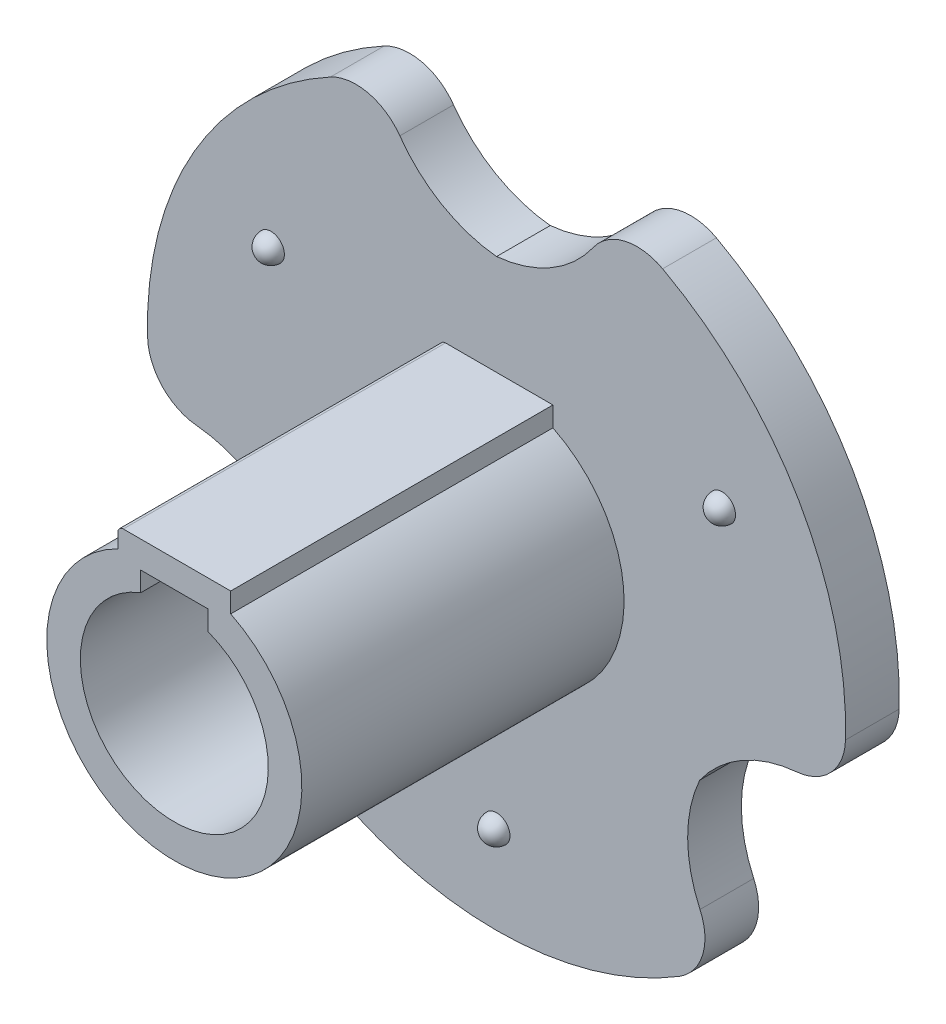
ISO-10303-21;
HEADER;
FILE_DESCRIPTION(('STEP AP214'),'2;1');
FILE_NAME('part.step','',(''),(''),'','','');
FILE_SCHEMA(('AUTOMOTIVE_DESIGN { 1 0 10303 214 1 1 1 1 }'));
ENDSEC;
DATA;
#1=APPLICATION_CONTEXT('core data for automotive mechanical design processes');
#2=APPLICATION_PROTOCOL_DEFINITION('international standard','automotive_design',2000,#1);
#3=PRODUCT_CONTEXT('',#1,'mechanical');
#4=PRODUCT('Part','Part','',(#3));
#5=PRODUCT_RELATED_PRODUCT_CATEGORY('part','',(#4));
#6=PRODUCT_DEFINITION_FORMATION('','',#4);
#7=PRODUCT_DEFINITION_CONTEXT('part definition',#1,'design');
#8=PRODUCT_DEFINITION('design','',#6,#7);
#9=PRODUCT_DEFINITION_SHAPE('','',#8);
#10=(LENGTH_UNIT() NAMED_UNIT(*) SI_UNIT(.MILLI.,.METRE.));
#11=(NAMED_UNIT(*) PLANE_ANGLE_UNIT() SI_UNIT($,.RADIAN.));
#12=(NAMED_UNIT(*) SI_UNIT($,.STERADIAN.) SOLID_ANGLE_UNIT());
#13=UNCERTAINTY_MEASURE_WITH_UNIT(LENGTH_MEASURE(1.E-05),#10,'distance_accuracy_value','');
#14=(GEOMETRIC_REPRESENTATION_CONTEXT(3) GLOBAL_UNCERTAINTY_ASSIGNED_CONTEXT((#13)) GLOBAL_UNIT_ASSIGNED_CONTEXT((#10,
#11,#12)) REPRESENTATION_CONTEXT('',''));
#15=CARTESIAN_POINT('',(0.,0.,0.));
#16=DIRECTION('',(0.,0.,1.));
#17=DIRECTION('',(1.,0.,0.));
#18=AXIS2_PLACEMENT_3D('',#15,#16,#17);
#19=CARTESIAN_POINT('',(0.,0.,-2.));
#20=DIRECTION('',(0.,0.,-1.));
#21=DIRECTION('',(-1.,0.,0.));
#22=AXIS2_PLACEMENT_3D('',#19,#20,#21);
#23=PLANE('',#22);
#24=CARTESIAN_POINT('',(0.,0.,-2.));
#25=DIRECTION('',(0.,0.,-1.));
#26=DIRECTION('',(-1.,0.,0.));
#27=AXIS2_PLACEMENT_3D('',#24,#25,#26);
#28=CIRCLE('',#27,6.);
#29=CARTESIAN_POINT('',(-6.,0.,-2.));
#30=VERTEX_POINT('',#29);
#31=EDGE_CURVE('E228',#30,#30,#28,.T.);
#32=ORIENTED_EDGE('',*,*,#31,.F.);
#33=EDGE_LOOP('',(#32));
#34=FACE_BOUND('',#33,.T.);
#35=CARTESIAN_POINT('',(10.995799380185,-0.303967088222063,-2.));
#36=DIRECTION('',(0.,0.,1.));
#37=DIRECTION('',(0.500000000000004,0.866025403784436,0.));
#38=AXIS2_PLACEMENT_3D('',#35,#36,#37);
#39=CIRCLE('',#38,2.);
#40=CARTESIAN_POINT('',(11.1783144305914,-2.29562174111125,-2.));
#41=VERTEX_POINT('',#40);
#42=CARTESIAN_POINT('',(12.9950356311278,-0.359233831535164,-2.));
#43=VERTEX_POINT('',#42);
#44=EDGE_CURVE('E204',#41,#43,#39,.T.);
#45=ORIENTED_EDGE('',*,*,#44,.F.);
#46=CARTESIAN_POINT('',(11.6346020566073,-7.27475837333423,-2.));
#47=DIRECTION('',(0.,0.,-1.));
#48=DIRECTION('',(-0.500000000000004,-0.866025403784436,0.));
#49=AXIS2_PLACEMENT_3D('',#46,#47,#48);
#50=CIRCLE('',#49,5.);
#51=CARTESIAN_POINT('',(7.5661233301834,-4.36830334140334,-2.));
#52=VERTEX_POINT('',#51);
#53=EDGE_CURVE('E478',#52,#41,#50,.T.);
#54=ORIENTED_EDGE('',*,*,#53,.F.);
#55=CARTESIAN_POINT('',(12.1174265860046,-6.43848175727757,-2.));
#56=DIRECTION('',(0.,0.,-1.));
#57=DIRECTION('',(0.500000000000004,0.866025403784436,0.));
#58=AXIS2_PLACEMENT_3D('',#55,#56,#57);
#59=CIRCLE('',#58,5.);
#60=CARTESIAN_POINT('',(7.57722396057783,-8.53289339782678,-2.));
#61=VERTEX_POINT('',#60);
#62=EDGE_CURVE('E213',#61,#52,#59,.T.);
#63=ORIENTED_EDGE('',*,*,#62,.F.);
#64=CARTESIAN_POINT('',(5.76114291040713,-9.37065805404646,-2.));
#65=DIRECTION('',(0.,0.,1.));
#66=DIRECTION('',(-0.500000000000004,-0.866025403784436,0.));
#67=AXIS2_PLACEMENT_3D('',#64,#65,#66);
#68=CIRCLE('',#67,2.);
#69=CARTESIAN_POINT('',(6.80862343957206,-11.0744140638731,-2.));
#70=VERTEX_POINT('',#69);
#71=EDGE_CURVE('E198',#70,#61,#68,.T.);
#72=ORIENTED_EDGE('',*,*,#71,.F.);
#73=CARTESIAN_POINT('',(0.,0.,-2.));
#74=DIRECTION('',(0.,0.,-1.));
#75=DIRECTION('',(-1.,0.,0.));
#76=AXIS2_PLACEMENT_3D('',#73,#74,#75);
#77=CIRCLE('',#76,13.);
#78=CARTESIAN_POINT('',(-6.80862343957222,-11.074414063873,-2.));
#79=VERTEX_POINT('',#78);
#80=EDGE_CURVE('E209',#70,#79,#77,.T.);
#81=ORIENTED_EDGE('',*,*,#80,.T.);
#82=CARTESIAN_POINT('',(-5.76114291040727,-9.37065805404637,-2.));
#83=DIRECTION('',(0.,0.,1.));
#84=DIRECTION('',(0.499999999999991,-0.866025403784444,0.));
#85=AXIS2_PLACEMENT_3D('',#82,#83,#84);
#86=CIRCLE('',#85,2.);
#87=CARTESIAN_POINT('',(-7.57722396057795,-8.53289339782666,-2.));
#88=VERTEX_POINT('',#87);
#89=EDGE_CURVE('E396',#88,#79,#86,.T.);
#90=ORIENTED_EDGE('',*,*,#89,.F.);
#91=CARTESIAN_POINT('',(-12.1174265860047,-6.43848175727739,-2.));
#92=DIRECTION('',(0.,0.,-1.));
#93=DIRECTION('',(-0.499999999999991,0.866025403784444,0.));
#94=AXIS2_PLACEMENT_3D('',#91,#92,#93);
#95=CIRCLE('',#94,5.);
#96=CARTESIAN_POINT('',(-7.56612333018347,-4.36830334140323,-2.));
#97=VERTEX_POINT('',#96);
#98=EDGE_CURVE('E414',#97,#88,#95,.T.);
#99=ORIENTED_EDGE('',*,*,#98,.F.);
#100=CARTESIAN_POINT('',(-11.6346020566074,-7.27475837333406,-2.));
#101=DIRECTION('',(0.,0.,-1.));
#102=DIRECTION('',(0.499999999999991,-0.866025403784444,0.));
#103=AXIS2_PLACEMENT_3D('',#100,#101,#102);
#104=CIRCLE('',#103,5.);
#105=CARTESIAN_POINT('',(-11.1783144305914,-2.29562174111109,-2.));
#106=VERTEX_POINT('',#105);
#107=EDGE_CURVE('E406',#106,#97,#104,.T.);
#108=ORIENTED_EDGE('',*,*,#107,.F.);
#109=CARTESIAN_POINT('',(-10.995799380185,-0.303967088221901,-2.));
#110=DIRECTION('',(0.,0.,1.));
#111=DIRECTION('',(-0.499999999999991,0.866025403784444,0.));
#112=AXIS2_PLACEMENT_3D('',#109,#110,#111);
#113=CIRCLE('',#112,2.);
#114=CARTESIAN_POINT('',(-12.9950356311278,-0.359233831534972,-2.));
#115=VERTEX_POINT('',#114);
#116=EDGE_CURVE('E403',#115,#106,#113,.T.);
#117=ORIENTED_EDGE('',*,*,#116,.F.);
#118=CARTESIAN_POINT('',(-6.18641219155567,11.4336478954082,-2.));
#119=VERTEX_POINT('',#118);
#120=EDGE_CURVE('E221',#115,#119,#77,.T.);
#121=ORIENTED_EDGE('',*,*,#120,.T.);
#122=CARTESIAN_POINT('',(-5.23465646977788,9.67462514226844,-2.));
#123=DIRECTION('',(0.,0.,1.));
#124=DIRECTION('',(-1.,0.,0.));
#125=AXIS2_PLACEMENT_3D('',#122,#123,#124);
#126=CIRCLE('',#125,2.);
#127=CARTESIAN_POINT('',(-3.60109047001354,10.8285151389379,-2.));
#128=VERTEX_POINT('',#127);
#129=EDGE_CURVE('E443',#128,#119,#126,.T.);
#130=ORIENTED_EDGE('',*,*,#129,.F.);
#131=CARTESIAN_POINT('',(0.482824529397304,13.7132401306117,-2.));
#132=DIRECTION('',(0.,0.,-1.));
#133=DIRECTION('',(1.,0.,0.));
#134=AXIS2_PLACEMENT_3D('',#131,#132,#133);
#135=CIRCLE('',#134,5.);
#136=CARTESIAN_POINT('',(0.,8.73660668280661,-2.));
#137=VERTEX_POINT('',#136);
#138=EDGE_CURVE('E440',#137,#128,#135,.T.);
#139=ORIENTED_EDGE('',*,*,#138,.F.);
#140=CARTESIAN_POINT('',(-0.482824529397304,13.7132401306117,-2.));
#141=DIRECTION('',(0.,0.,-1.));
#142=DIRECTION('',(-1.,0.,0.));
#143=AXIS2_PLACEMENT_3D('',#140,#141,#142);
#144=CIRCLE('',#143,5.);
#145=CARTESIAN_POINT('',(3.60109047001354,10.8285151389379,-2.));
#146=VERTEX_POINT('',#145);
#147=EDGE_CURVE('E437',#146,#137,#144,.T.);
#148=ORIENTED_EDGE('',*,*,#147,.F.);
#149=CARTESIAN_POINT('',(5.23465646977788,9.67462514226844,-2.));
#150=DIRECTION('',(0.,0.,1.));
#151=DIRECTION('',(1.,0.,0.));
#152=AXIS2_PLACEMENT_3D('',#149,#150,#151);
#153=CIRCLE('',#152,2.);
#154=CARTESIAN_POINT('',(6.18641219155567,11.4336478954082,-2.));
#155=VERTEX_POINT('',#154);
#156=EDGE_CURVE('E434',#155,#146,#153,.T.);
#157=ORIENTED_EDGE('',*,*,#156,.F.);
#158=EDGE_CURVE('E220',#155,#43,#77,.T.);
#159=ORIENTED_EDGE('',*,*,#158,.T.);
#160=EDGE_LOOP('',(#45,#54,#63,#72,#81,#90,#99,#108,#117,#121,#130,#139,#148,#157,#159));
#161=FACE_BOUND('',#160,.T.);
#162=ADVANCED_FACE('F37',(#34,#161),#23,.T.);
#163=CARTESIAN_POINT('',(0.,0.,0.));
#164=DIRECTION('',(0.,0.,-1.));
#165=DIRECTION('',(-1.,0.,0.));
#166=AXIS2_PLACEMENT_3D('',#163,#164,#165);
#167=PLANE('',#166);
#168=CARTESIAN_POINT('',(8.4004464167091,4.84999999999992,0.));
#169=DIRECTION('',(0.,0.,-1.));
#170=DIRECTION('',(-1.,0.,0.));
#171=AXIS2_PLACEMENT_3D('',#168,#169,#170);
#172=CIRCLE('',#171,0.5);
#173=CARTESIAN_POINT('',(7.9004464167091,4.84999999999992,0.));
#174=VERTEX_POINT('',#173);
#175=EDGE_CURVE('E300',#174,#174,#172,.F.);
#176=ORIENTED_EDGE('',*,*,#175,.F.);
#177=EDGE_LOOP('',(#176));
#178=FACE_BOUND('',#177,.T.);
#179=CARTESIAN_POINT('',(-8.40044641670903,4.85000000000004,0.));
#180=DIRECTION('',(0.,0.,-1.));
#181=DIRECTION('',(-1.,0.,0.));
#182=AXIS2_PLACEMENT_3D('',#179,#180,#181);
#183=CIRCLE('',#182,0.5);
#184=CARTESIAN_POINT('',(-8.90044641670903,4.85000000000004,0.));
#185=VERTEX_POINT('',#184);
#186=EDGE_CURVE('E297',#185,#185,#183,.F.);
#187=ORIENTED_EDGE('',*,*,#186,.F.);
#188=EDGE_LOOP('',(#187));
#189=FACE_BOUND('',#188,.T.);
#190=CARTESIAN_POINT('',(0.,-9.7,0.));
#191=DIRECTION('',(0.,0.,-1.));
#192=DIRECTION('',(-1.,0.,0.));
#193=AXIS2_PLACEMENT_3D('',#190,#191,#192);
#194=CIRCLE('',#193,0.5);
#195=CARTESIAN_POINT('',(-0.499999999999999,-9.7,0.));
#196=VERTEX_POINT('',#195);
#197=EDGE_CURVE('E294',#196,#196,#194,.F.);
#198=ORIENTED_EDGE('',*,*,#197,.F.);
#199=EDGE_LOOP('',(#198));
#200=FACE_BOUND('',#199,.T.);
#201=DIRECTION('',(0.,-1.,0.));
#202=VECTOR('',#201,1.);
#203=CARTESIAN_POINT('',(-2.1,5.,0.));
#204=LINE('',#203,#202);
#205=CARTESIAN_POINT('',(-2.1,4.8,0.));
#206=VERTEX_POINT('',#205);
#207=CARTESIAN_POINT('',(-2.1,4.26057507855454,0.));
#208=VERTEX_POINT('',#207);
#209=EDGE_CURVE('E250',#206,#208,#204,.T.);
#210=ORIENTED_EDGE('',*,*,#209,.F.);
#211=CARTESIAN_POINT('',(-1.9,4.8,0.));
#212=DIRECTION('',(0.,0.,-1.));
#213=DIRECTION('',(-1.,0.,0.));
#214=AXIS2_PLACEMENT_3D('',#211,#212,#213);
#215=CIRCLE('',#214,0.2);
#216=CARTESIAN_POINT('',(-1.9,5.,0.));
#217=VERTEX_POINT('',#216);
#218=EDGE_CURVE('E11',#206,#217,#215,.T.);
#219=ORIENTED_EDGE('',*,*,#218,.T.);
#220=DIRECTION('',(-1.,0.,0.));
#221=VECTOR('',#220,1.);
#222=CARTESIAN_POINT('',(-2.1,5.,0.));
#223=LINE('',#222,#221);
#224=CARTESIAN_POINT('',(2.1,5.,0.));
#225=VERTEX_POINT('',#224);
#226=EDGE_CURVE('E254',#225,#217,#223,.T.);
#227=ORIENTED_EDGE('',*,*,#226,.F.);
#228=DIRECTION('',(0.,1.,0.));
#229=VECTOR('',#228,1.);
#230=CARTESIAN_POINT('',(2.1,5.,0.));
#231=LINE('',#230,#229);
#232=CARTESIAN_POINT('',(2.1,4.26057507855454,0.));
#233=VERTEX_POINT('',#232);
#234=EDGE_CURVE('E266',#233,#225,#231,.T.);
#235=ORIENTED_EDGE('',*,*,#234,.F.);
#236=CARTESIAN_POINT('',(0.,0.,0.));
#237=DIRECTION('',(0.,0.,1.));
#238=DIRECTION('',(1.,0.,0.));
#239=AXIS2_PLACEMENT_3D('',#236,#237,#238);
#240=CIRCLE('',#239,4.75);
#241=EDGE_CURVE('E263',#208,#233,#240,.T.);
#242=ORIENTED_EDGE('',*,*,#241,.F.);
#243=EDGE_LOOP('',(#210,#219,#227,#235,#242));
#244=FACE_BOUND('',#243,.T.);
#245=CARTESIAN_POINT('',(11.6346020566073,-7.27475837333423,0.));
#246=DIRECTION('',(0.,0.,-1.));
#247=DIRECTION('',(-1.,0.,0.));
#248=AXIS2_PLACEMENT_3D('',#245,#246,#247);
#249=CIRCLE('',#248,5.);
#250=CARTESIAN_POINT('',(11.1783144305914,-2.29562174111125,0.));
#251=VERTEX_POINT('',#250);
#252=CARTESIAN_POINT('',(7.5661233301834,-4.36830334140334,0.));
#253=VERTEX_POINT('',#252);
#254=EDGE_CURVE('E470',#251,#253,#249,.F.);
#255=ORIENTED_EDGE('',*,*,#254,.F.);
#256=CARTESIAN_POINT('',(10.995799380185,-0.303967088222063,0.));
#257=DIRECTION('',(0.,0.,-1.));
#258=DIRECTION('',(-1.,0.,0.));
#259=AXIS2_PLACEMENT_3D('',#256,#257,#258);
#260=CIRCLE('',#259,2.);
#261=CARTESIAN_POINT('',(12.9950356311278,-0.359233831535164,0.));
#262=VERTEX_POINT('',#261);
#263=EDGE_CURVE('E214',#262,#251,#260,.T.);
#264=ORIENTED_EDGE('',*,*,#263,.F.);
#265=CARTESIAN_POINT('',(0.,0.,0.));
#266=DIRECTION('',(0.,0.,-1.));
#267=DIRECTION('',(-1.,0.,0.));
#268=AXIS2_PLACEMENT_3D('',#265,#266,#267);
#269=CIRCLE('',#268,13.);
#270=CARTESIAN_POINT('',(6.18641219155567,11.4336478954082,0.));
#271=VERTEX_POINT('',#270);
#272=EDGE_CURVE('E225',#271,#262,#269,.T.);
#273=ORIENTED_EDGE('',*,*,#272,.F.);
#274=CARTESIAN_POINT('',(5.23465646977788,9.67462514226844,0.));
#275=DIRECTION('',(0.,0.,-1.));
#276=DIRECTION('',(-1.,0.,0.));
#277=AXIS2_PLACEMENT_3D('',#274,#275,#276);
#278=CIRCLE('',#277,2.);
#279=CARTESIAN_POINT('',(3.60109047001354,10.8285151389379,0.));
#280=VERTEX_POINT('',#279);
#281=EDGE_CURVE('E381',#280,#271,#278,.T.);
#282=ORIENTED_EDGE('',*,*,#281,.F.);
#283=CARTESIAN_POINT('',(-0.482824529397304,13.7132401306117,0.));
#284=DIRECTION('',(0.,0.,-1.));
#285=DIRECTION('',(-1.,0.,0.));
#286=AXIS2_PLACEMENT_3D('',#283,#284,#285);
#287=CIRCLE('',#286,5.);
#288=CARTESIAN_POINT('',(0.,8.73660668280661,0.));
#289=VERTEX_POINT('',#288);
#290=EDGE_CURVE('E426',#289,#280,#287,.F.);
#291=ORIENTED_EDGE('',*,*,#290,.F.);
#292=CARTESIAN_POINT('',(0.482824529397304,13.7132401306117,0.));
#293=DIRECTION('',(0.,0.,-1.));
#294=DIRECTION('',(-1.,0.,0.));
#295=AXIS2_PLACEMENT_3D('',#292,#293,#294);
#296=CIRCLE('',#295,5.);
#297=CARTESIAN_POINT('',(-3.60109047001354,10.8285151389379,0.));
#298=VERTEX_POINT('',#297);
#299=EDGE_CURVE('E428',#298,#289,#296,.F.);
#300=ORIENTED_EDGE('',*,*,#299,.F.);
#301=CARTESIAN_POINT('',(-5.23465646977788,9.67462514226844,0.));
#302=DIRECTION('',(0.,0.,-1.));
#303=DIRECTION('',(-1.,0.,0.));
#304=AXIS2_PLACEMENT_3D('',#301,#302,#303);
#305=CIRCLE('',#304,2.);
#306=CARTESIAN_POINT('',(-6.18641219155567,11.4336478954082,0.));
#307=VERTEX_POINT('',#306);
#308=EDGE_CURVE('E431',#307,#298,#305,.T.);
#309=ORIENTED_EDGE('',*,*,#308,.F.);
#310=CARTESIAN_POINT('',(-12.9950356311278,-0.359233831534973,0.));
#311=VERTEX_POINT('',#310);
#312=EDGE_CURVE('E233',#311,#307,#269,.T.);
#313=ORIENTED_EDGE('',*,*,#312,.F.);
#314=CARTESIAN_POINT('',(-10.995799380185,-0.303967088221901,0.));
#315=DIRECTION('',(0.,0.,-1.));
#316=DIRECTION('',(-1.,0.,0.));
#317=AXIS2_PLACEMENT_3D('',#314,#315,#316);
#318=CIRCLE('',#317,2.);
#319=CARTESIAN_POINT('',(-11.1783144305914,-2.29562174111109,0.));
#320=VERTEX_POINT('',#319);
#321=EDGE_CURVE('E60',#320,#311,#318,.T.);
#322=ORIENTED_EDGE('',*,*,#321,.F.);
#323=CARTESIAN_POINT('',(-11.6346020566074,-7.27475837333406,0.));
#324=DIRECTION('',(0.,0.,-1.));
#325=DIRECTION('',(-1.,0.,0.));
#326=AXIS2_PLACEMENT_3D('',#323,#324,#325);
#327=CIRCLE('',#326,5.);
#328=CARTESIAN_POINT('',(-7.56612333018347,-4.36830334140323,0.));
#329=VERTEX_POINT('',#328);
#330=EDGE_CURVE('E408',#329,#320,#327,.F.);
#331=ORIENTED_EDGE('',*,*,#330,.F.);
#332=CARTESIAN_POINT('',(-12.1174265860047,-6.43848175727739,0.));
#333=DIRECTION('',(0.,0.,-1.));
#334=DIRECTION('',(-1.,0.,0.));
#335=AXIS2_PLACEMENT_3D('',#332,#333,#334);
#336=CIRCLE('',#335,5.);
#337=CARTESIAN_POINT('',(-7.57722396057795,-8.53289339782666,0.));
#338=VERTEX_POINT('',#337);
#339=EDGE_CURVE('E402',#338,#329,#336,.F.);
#340=ORIENTED_EDGE('',*,*,#339,.F.);
#341=CARTESIAN_POINT('',(-5.76114291040727,-9.37065805404637,0.));
#342=DIRECTION('',(0.,0.,-1.));
#343=DIRECTION('',(-1.,0.,0.));
#344=AXIS2_PLACEMENT_3D('',#341,#342,#343);
#345=CIRCLE('',#344,2.);
#346=CARTESIAN_POINT('',(-6.80862343957222,-11.074414063873,0.));
#347=VERTEX_POINT('',#346);
#348=EDGE_CURVE('E394',#347,#338,#345,.T.);
#349=ORIENTED_EDGE('',*,*,#348,.F.);
#350=CARTESIAN_POINT('',(6.80862343957206,-11.0744140638731,0.));
#351=VERTEX_POINT('',#350);
#352=EDGE_CURVE('E232',#351,#347,#269,.T.);
#353=ORIENTED_EDGE('',*,*,#352,.F.);
#354=CARTESIAN_POINT('',(5.76114291040713,-9.37065805404646,0.));
#355=DIRECTION('',(0.,0.,-1.));
#356=DIRECTION('',(-1.,0.,0.));
#357=AXIS2_PLACEMENT_3D('',#354,#355,#356);
#358=CIRCLE('',#357,2.);
#359=CARTESIAN_POINT('',(7.57722396057783,-8.53289339782678,0.));
#360=VERTEX_POINT('',#359);
#361=EDGE_CURVE('E52',#360,#351,#358,.T.);
#362=ORIENTED_EDGE('',*,*,#361,.F.);
#363=CARTESIAN_POINT('',(12.1174265860046,-6.43848175727757,0.));
#364=DIRECTION('',(0.,0.,-1.));
#365=DIRECTION('',(-1.,0.,0.));
#366=AXIS2_PLACEMENT_3D('',#363,#364,#365);
#367=CIRCLE('',#366,5.);
#368=EDGE_CURVE('E473',#253,#360,#367,.F.);
#369=ORIENTED_EDGE('',*,*,#368,.F.);
#370=EDGE_LOOP('',(#255,#264,#273,#282,#291,#300,#309,#313,#322,#331,#340,#349,#353,#362,#369));
#371=FACE_BOUND('',#370,.T.);
#372=ADVANCED_FACE('F322',(#178,#189,#200,#244,#371),#167,.F.);
#373=CARTESIAN_POINT('',(0.,0.,-2.));
#374=DIRECTION('',(0.,0.,1.));
#375=DIRECTION('',(1.,0.,0.));
#376=AXIS2_PLACEMENT_3D('',#373,#374,#375);
#377=CYLINDRICAL_SURFACE('',#376,13.);
#378=DIRECTION('',(0.,0.,-1.));
#379=VECTOR('',#378,1.);
#380=CARTESIAN_POINT('',(6.80862343957206,-11.0744140638731,12.001));
#381=LINE('',#380,#379);
#382=EDGE_CURVE('E195',#351,#70,#381,.T.);
#383=ORIENTED_EDGE('',*,*,#382,.F.);
#384=ORIENTED_EDGE('',*,*,#352,.T.);
#385=DIRECTION('',(0.,0.,-1.));
#386=VECTOR('',#385,1.);
#387=CARTESIAN_POINT('',(-6.80862343957222,-11.074414063873,12.001));
#388=LINE('',#387,#386);
#389=EDGE_CURVE('E219',#347,#79,#388,.T.);
#390=ORIENTED_EDGE('',*,*,#389,.T.);
#391=ORIENTED_EDGE('',*,*,#80,.F.);
#392=EDGE_LOOP('',(#383,#384,#390,#391));
#393=FACE_BOUND('',#392,.T.);
#394=ADVANCED_FACE('F217',(#393),#377,.T.);
#395=DIRECTION('',(0.,0.,-1.));
#396=VECTOR('',#395,1.);
#397=CARTESIAN_POINT('',(-12.9950356311278,-0.359233831534972,12.001));
#398=LINE('',#397,#396);
#399=EDGE_CURVE('E417',#311,#115,#398,.T.);
#400=ORIENTED_EDGE('',*,*,#399,.F.);
#401=ORIENTED_EDGE('',*,*,#312,.T.);
#402=DIRECTION('',(0.,0.,-1.));
#403=VECTOR('',#402,1.);
#404=CARTESIAN_POINT('',(-6.18641219155567,11.4336478954082,12.001));
#405=LINE('',#404,#403);
#406=EDGE_CURVE('E447',#307,#119,#405,.T.);
#407=ORIENTED_EDGE('',*,*,#406,.T.);
#408=ORIENTED_EDGE('',*,*,#120,.F.);
#409=EDGE_LOOP('',(#400,#401,#407,#408));
#410=FACE_BOUND('',#409,.T.);
#411=ADVANCED_FACE('F354',(#410),#377,.T.);
#412=CARTESIAN_POINT('',(0.,0.,-2.));
#413=DIRECTION('',(0.,0.,-1.));
#414=DIRECTION('',(-1.,0.,0.));
#415=AXIS2_PLACEMENT_3D('',#412,#413,#414);
#416=CIRCLE('',#415,4.75);
#417=CARTESIAN_POINT('',(-4.75,0.,-2.));
#418=VERTEX_POINT('',#417);
#419=EDGE_CURVE('E279',#418,#418,#416,.F.);
#420=ORIENTED_EDGE('',*,*,#419,.F.);
#421=EDGE_LOOP('',(#420));
#422=FACE_BOUND('',#421,.T.);
#423=DIRECTION('',(0.,-1.,0.));
#424=VECTOR('',#423,1.);
#425=CARTESIAN_POINT('',(-1.25,4.,-2.));
#426=LINE('',#425,#424);
#427=CARTESIAN_POINT('',(-1.25,4.,-2.));
#428=VERTEX_POINT('',#427);
#429=CARTESIAN_POINT('',(-1.25,3.2691742076555,-2.));
#430=VERTEX_POINT('',#429);
#431=EDGE_CURVE('E370',#428,#430,#426,.T.);
#432=ORIENTED_EDGE('',*,*,#431,.T.);
#433=CARTESIAN_POINT('',(0.,0.,-2.));
#434=DIRECTION('',(0.,0.,-1.));
#435=DIRECTION('',(-1.,0.,0.));
#436=AXIS2_PLACEMENT_3D('',#433,#434,#435);
#437=CIRCLE('',#436,3.5);
#438=CARTESIAN_POINT('',(1.25,3.2691742076555,-2.));
#439=VERTEX_POINT('',#438);
#440=EDGE_CURVE('E373',#430,#439,#437,.F.);
#441=ORIENTED_EDGE('',*,*,#440,.T.);
#442=DIRECTION('',(0.,1.,0.));
#443=VECTOR('',#442,1.);
#444=CARTESIAN_POINT('',(1.25,3.2691742076555,-2.));
#445=LINE('',#444,#443);
#446=CARTESIAN_POINT('',(1.25,4.,-2.));
#447=VERTEX_POINT('',#446);
#448=EDGE_CURVE('E379',#439,#447,#445,.T.);
#449=ORIENTED_EDGE('',*,*,#448,.T.);
#450=DIRECTION('',(-1.,0.,0.));
#451=VECTOR('',#450,1.);
#452=CARTESIAN_POINT('',(1.25,4.,-2.));
#453=LINE('',#452,#451);
#454=EDGE_CURVE('E375',#447,#428,#453,.T.);
#455=ORIENTED_EDGE('',*,*,#454,.T.);
#456=EDGE_LOOP('',(#432,#441,#449,#455));
#457=FACE_BOUND('',#456,.T.);
#458=ADVANCED_FACE('F345',(#422,#457),#23,.T.);
#459=CARTESIAN_POINT('',(0.,0.,12.));
#460=DIRECTION('',(0.,0.,1.));
#461=DIRECTION('',(1.,0.,0.));
#462=AXIS2_PLACEMENT_3D('',#459,#460,#461);
#463=PLANE('',#462);
#464=DIRECTION('',(-1.,0.,0.));
#465=VECTOR('',#464,1.);
#466=CARTESIAN_POINT('',(-2.1,5.,12.));
#467=LINE('',#466,#465);
#468=CARTESIAN_POINT('',(2.1,5.,12.));
#469=VERTEX_POINT('',#468);
#470=CARTESIAN_POINT('',(-1.9,5.,12.));
#471=VERTEX_POINT('',#470);
#472=EDGE_CURVE('E258',#469,#471,#467,.T.);
#473=ORIENTED_EDGE('',*,*,#472,.T.);
#474=CARTESIAN_POINT('',(-1.9,4.8,12.));
#475=DIRECTION('',(0.,0.,1.));
#476=DIRECTION('',(1.,0.,0.));
#477=AXIS2_PLACEMENT_3D('',#474,#475,#476);
#478=CIRCLE('',#477,0.2);
#479=CARTESIAN_POINT('',(-2.1,4.8,12.));
#480=VERTEX_POINT('',#479);
#481=EDGE_CURVE('E45',#471,#480,#478,.T.);
#482=ORIENTED_EDGE('',*,*,#481,.T.);
#483=DIRECTION('',(0.,-1.,0.));
#484=VECTOR('',#483,1.);
#485=CARTESIAN_POINT('',(-2.1,5.,12.));
#486=LINE('',#485,#484);
#487=CARTESIAN_POINT('',(-2.1,4.26057507855454,12.));
#488=VERTEX_POINT('',#487);
#489=EDGE_CURVE('E251',#480,#488,#486,.T.);
#490=ORIENTED_EDGE('',*,*,#489,.T.);
#491=CARTESIAN_POINT('',(0.,0.,12.));
#492=DIRECTION('',(0.,0.,1.));
#493=DIRECTION('',(1.,0.,0.));
#494=AXIS2_PLACEMENT_3D('',#491,#492,#493);
#495=CIRCLE('',#494,4.75);
#496=CARTESIAN_POINT('',(2.1,4.26057507855454,12.));
#497=VERTEX_POINT('',#496);
#498=EDGE_CURVE('E253',#488,#497,#495,.T.);
#499=ORIENTED_EDGE('',*,*,#498,.T.);
#500=DIRECTION('',(0.,1.,0.));
#501=VECTOR('',#500,1.);
#502=CARTESIAN_POINT('',(2.1,5.,12.));
#503=LINE('',#502,#501);
#504=EDGE_CURVE('E256',#497,#469,#503,.T.);
#505=ORIENTED_EDGE('',*,*,#504,.T.);
#506=EDGE_LOOP('',(#473,#482,#490,#499,#505));
#507=FACE_BOUND('',#506,.T.);
#508=CARTESIAN_POINT('',(0.,0.,12.));
#509=DIRECTION('',(0.,0.,1.));
#510=DIRECTION('',(1.,0.,0.));
#511=AXIS2_PLACEMENT_3D('',#508,#509,#510);
#512=CIRCLE('',#511,3.5);
#513=CARTESIAN_POINT('',(-1.25,3.2691742076555,12.));
#514=VERTEX_POINT('',#513);
#515=CARTESIAN_POINT('',(1.25,3.2691742076555,12.));
#516=VERTEX_POINT('',#515);
#517=EDGE_CURVE('E235',#514,#516,#512,.T.);
#518=ORIENTED_EDGE('',*,*,#517,.F.);
#519=DIRECTION('',(0.,-1.,0.));
#520=VECTOR('',#519,1.);
#521=CARTESIAN_POINT('',(-1.25,4.,12.));
#522=LINE('',#521,#520);
#523=CARTESIAN_POINT('',(-1.25,4.,12.));
#524=VERTEX_POINT('',#523);
#525=EDGE_CURVE('E224',#524,#514,#522,.T.);
#526=ORIENTED_EDGE('',*,*,#525,.F.);
#527=DIRECTION('',(-1.,0.,0.));
#528=VECTOR('',#527,1.);
#529=CARTESIAN_POINT('',(-1.25,4.,12.));
#530=LINE('',#529,#528);
#531=CARTESIAN_POINT('',(1.25,4.,12.));
#532=VERTEX_POINT('',#531);
#533=EDGE_CURVE('E240',#532,#524,#530,.T.);
#534=ORIENTED_EDGE('',*,*,#533,.F.);
#535=DIRECTION('',(0.,1.,0.));
#536=VECTOR('',#535,1.);
#537=CARTESIAN_POINT('',(1.25,4.,12.));
#538=LINE('',#537,#536);
#539=EDGE_CURVE('E237',#516,#532,#538,.T.);
#540=ORIENTED_EDGE('',*,*,#539,.F.);
#541=EDGE_LOOP('',(#518,#526,#534,#540));
#542=FACE_BOUND('',#541,.T.);
#543=ADVANCED_FACE('F310',(#507,#542),#463,.T.);
#544=CARTESIAN_POINT('',(-2.1,5.,12.));
#545=DIRECTION('',(1.,0.,0.));
#546=DIRECTION('',(0.,0.,-1.));
#547=AXIS2_PLACEMENT_3D('',#544,#545,#546);
#548=PLANE('',#547);
#549=ORIENTED_EDGE('',*,*,#489,.F.);
#550=DIRECTION('',(0.,0.,-1.));
#551=VECTOR('',#550,1.);
#552=CARTESIAN_POINT('',(-2.1,4.8,12.));
#553=LINE('',#552,#551);
#554=EDGE_CURVE('E303',#480,#206,#553,.T.);
#555=ORIENTED_EDGE('',*,*,#554,.T.);
#556=ORIENTED_EDGE('',*,*,#209,.T.);
#557=DIRECTION('',(0.,0.,-1.));
#558=VECTOR('',#557,1.);
#559=CARTESIAN_POINT('',(-2.1,4.26057507855454,12.));
#560=LINE('',#559,#558);
#561=EDGE_CURVE('E276',#488,#208,#560,.T.);
#562=ORIENTED_EDGE('',*,*,#561,.F.);
#563=EDGE_LOOP('',(#549,#555,#556,#562));
#564=FACE_BOUND('',#563,.T.);
#565=ADVANCED_FACE('F319',(#564),#548,.F.);
#566=CARTESIAN_POINT('',(0.,0.,12.));
#567=DIRECTION('',(0.,0.,-1.));
#568=DIRECTION('',(-1.,0.,0.));
#569=AXIS2_PLACEMENT_3D('',#566,#567,#568);
#570=CYLINDRICAL_SURFACE('',#569,4.75);
#571=ORIENTED_EDGE('',*,*,#241,.T.);
#572=DIRECTION('',(0.,0.,-1.));
#573=VECTOR('',#572,1.);
#574=CARTESIAN_POINT('',(2.1,4.26057507855454,12.));
#575=LINE('',#574,#573);
#576=EDGE_CURVE('E273',#497,#233,#575,.T.);
#577=ORIENTED_EDGE('',*,*,#576,.F.);
#578=ORIENTED_EDGE('',*,*,#498,.F.);
#579=ORIENTED_EDGE('',*,*,#561,.T.);
#580=EDGE_LOOP('',(#571,#577,#578,#579));
#581=FACE_BOUND('',#580,.T.);
#582=ADVANCED_FACE('F333',(#581),#570,.T.);
#583=CARTESIAN_POINT('',(2.1,5.,12.));
#584=DIRECTION('',(-1.,0.,0.));
#585=DIRECTION('',(0.,-1.,0.));
#586=AXIS2_PLACEMENT_3D('',#583,#584,#585);
#587=PLANE('',#586);
#588=ORIENTED_EDGE('',*,*,#234,.T.);
#589=DIRECTION('',(0.,0.,-1.));
#590=VECTOR('',#589,1.);
#591=CARTESIAN_POINT('',(2.1,5.,12.));
#592=LINE('',#591,#590);
#593=EDGE_CURVE('E261',#469,#225,#592,.T.);
#594=ORIENTED_EDGE('',*,*,#593,.F.);
#595=ORIENTED_EDGE('',*,*,#504,.F.);
#596=ORIENTED_EDGE('',*,*,#576,.T.);
#597=EDGE_LOOP('',(#588,#594,#595,#596));
#598=FACE_BOUND('',#597,.T.);
#599=ADVANCED_FACE('F330',(#598),#587,.F.);
#600=CARTESIAN_POINT('',(-2.1,5.,12.));
#601=DIRECTION('',(0.,-1.,0.));
#602=DIRECTION('',(1.,0.,0.));
#603=AXIS2_PLACEMENT_3D('',#600,#601,#602);
#604=PLANE('',#603);
#605=ORIENTED_EDGE('',*,*,#226,.T.);
#606=DIRECTION('',(0.,0.,-1.));
#607=VECTOR('',#606,1.);
#608=CARTESIAN_POINT('',(-1.9,5.,12.));
#609=LINE('',#608,#607);
#610=EDGE_CURVE('E306',#217,#471,#609,.F.);
#611=ORIENTED_EDGE('',*,*,#610,.T.);
#612=ORIENTED_EDGE('',*,*,#472,.F.);
#613=ORIENTED_EDGE('',*,*,#593,.T.);
#614=EDGE_LOOP('',(#605,#611,#612,#613));
#615=FACE_BOUND('',#614,.T.);
#616=ADVANCED_FACE('F326',(#615),#604,.F.);
#617=CARTESIAN_POINT('',(-1.25,4.,12.));
#618=DIRECTION('',(1.,0.,0.));
#619=DIRECTION('',(0.,1.,0.));
#620=AXIS2_PLACEMENT_3D('',#617,#618,#619);
#621=PLANE('',#620);
#622=DIRECTION('',(0.,0.,-1.));
#623=VECTOR('',#622,1.);
#624=CARTESIAN_POINT('',(-1.25,3.2691742076555,12.));
#625=LINE('',#624,#623);
#626=EDGE_CURVE('E248',#514,#430,#625,.T.);
#627=ORIENTED_EDGE('',*,*,#626,.T.);
#628=ORIENTED_EDGE('',*,*,#431,.F.);
#629=DIRECTION('',(0.,0.,-1.));
#630=VECTOR('',#629,1.);
#631=CARTESIAN_POINT('',(-1.25,4.,12.));
#632=LINE('',#631,#630);
#633=EDGE_CURVE('E242',#524,#428,#632,.T.);
#634=ORIENTED_EDGE('',*,*,#633,.F.);
#635=ORIENTED_EDGE('',*,*,#525,.T.);
#636=EDGE_LOOP('',(#627,#628,#634,#635));
#637=FACE_BOUND('',#636,.T.);
#638=ADVANCED_FACE('F744',(#637),#621,.T.);
#639=CARTESIAN_POINT('',(0.,0.,12.));
#640=DIRECTION('',(0.,0.,-1.));
#641=DIRECTION('',(-1.,0.,0.));
#642=AXIS2_PLACEMENT_3D('',#639,#640,#641);
#643=CYLINDRICAL_SURFACE('',#642,3.5);
#644=DIRECTION('',(0.,0.,-1.));
#645=VECTOR('',#644,1.);
#646=CARTESIAN_POINT('',(1.25,3.2691742076555,12.));
#647=LINE('',#646,#645);
#648=EDGE_CURVE('E246',#516,#439,#647,.T.);
#649=ORIENTED_EDGE('',*,*,#648,.T.);
#650=ORIENTED_EDGE('',*,*,#440,.F.);
#651=ORIENTED_EDGE('',*,*,#626,.F.);
#652=ORIENTED_EDGE('',*,*,#517,.T.);
#653=EDGE_LOOP('',(#649,#650,#651,#652));
#654=FACE_BOUND('',#653,.T.);
#655=ADVANCED_FACE('F750',(#654),#643,.F.);
#656=CARTESIAN_POINT('',(1.25,4.,12.));
#657=DIRECTION('',(-1.,0.,0.));
#658=DIRECTION('',(0.,-1.,0.));
#659=AXIS2_PLACEMENT_3D('',#656,#657,#658);
#660=PLANE('',#659);
#661=DIRECTION('',(0.,0.,-1.));
#662=VECTOR('',#661,1.);
#663=CARTESIAN_POINT('',(1.25,4.,12.));
#664=LINE('',#663,#662);
#665=EDGE_CURVE('E244',#532,#447,#664,.T.);
#666=ORIENTED_EDGE('',*,*,#665,.T.);
#667=ORIENTED_EDGE('',*,*,#448,.F.);
#668=ORIENTED_EDGE('',*,*,#648,.F.);
#669=ORIENTED_EDGE('',*,*,#539,.T.);
#670=EDGE_LOOP('',(#666,#667,#668,#669));
#671=FACE_BOUND('',#670,.T.);
#672=ADVANCED_FACE('F763',(#671),#660,.T.);
#673=CARTESIAN_POINT('',(-1.25,4.,12.));
#674=DIRECTION('',(0.,-1.,0.));
#675=DIRECTION('',(1.,0.,0.));
#676=AXIS2_PLACEMENT_3D('',#673,#674,#675);
#677=PLANE('',#676);
#678=ORIENTED_EDGE('',*,*,#633,.T.);
#679=ORIENTED_EDGE('',*,*,#454,.F.);
#680=ORIENTED_EDGE('',*,*,#665,.F.);
#681=ORIENTED_EDGE('',*,*,#533,.T.);
#682=EDGE_LOOP('',(#678,#679,#680,#681));
#683=FACE_BOUND('',#682,.T.);
#684=ADVANCED_FACE('F657',(#683),#677,.T.);
#685=ORIENTED_EDGE('',*,*,#272,.T.);
#686=DIRECTION('',(0.,0.,-1.));
#687=VECTOR('',#686,1.);
#688=CARTESIAN_POINT('',(12.9950356311278,-0.359233831535164,12.001));
#689=LINE('',#688,#687);
#690=EDGE_CURVE('E482',#262,#43,#689,.T.);
#691=ORIENTED_EDGE('',*,*,#690,.T.);
#692=ORIENTED_EDGE('',*,*,#158,.F.);
#693=DIRECTION('',(0.,0.,-1.));
#694=VECTOR('',#693,1.);
#695=CARTESIAN_POINT('',(6.18641219155567,11.4336478954082,12.001));
#696=LINE('',#695,#694);
#697=EDGE_CURVE('E446',#271,#155,#696,.T.);
#698=ORIENTED_EDGE('',*,*,#697,.F.);
#699=EDGE_LOOP('',(#685,#691,#692,#698));
#700=FACE_BOUND('',#699,.T.);
#701=ADVANCED_FACE('F363',(#700),#377,.T.);
#702=CARTESIAN_POINT('',(0.,0.,-3.1));
#703=DIRECTION('',(0.,0.,-1.));
#704=DIRECTION('',(-1.,0.,0.));
#705=AXIS2_PLACEMENT_3D('',#702,#703,#704);
#706=PLANE('',#705);
#707=CARTESIAN_POINT('',(0.,0.,-3.1));
#708=DIRECTION('',(0.,0.,-1.));
#709=DIRECTION('',(-1.,0.,0.));
#710=AXIS2_PLACEMENT_3D('',#707,#708,#709);
#711=CIRCLE('',#710,5.25);
#712=CARTESIAN_POINT('',(-5.25,0.,-3.1));
#713=VERTEX_POINT('',#712);
#714=EDGE_CURVE('E291',#713,#713,#711,.F.);
#715=ORIENTED_EDGE('',*,*,#714,.T.);
#716=EDGE_LOOP('',(#715));
#717=FACE_BOUND('',#716,.T.);
#718=CARTESIAN_POINT('',(0.,0.,-3.1));
#719=DIRECTION('',(0.,0.,-1.));
#720=DIRECTION('',(-1.,0.,0.));
#721=AXIS2_PLACEMENT_3D('',#718,#719,#720);
#722=CIRCLE('',#721,5.5);
#723=CARTESIAN_POINT('',(-5.5,0.,-3.1));
#724=VERTEX_POINT('',#723);
#725=EDGE_CURVE('E282',#724,#724,#722,.T.);
#726=ORIENTED_EDGE('',*,*,#725,.T.);
#727=EDGE_LOOP('',(#726));
#728=FACE_BOUND('',#727,.T.);
#729=ADVANCED_FACE('F547',(#717,#728),#706,.T.);
#730=CARTESIAN_POINT('',(0.,0.,-3.1));
#731=DIRECTION('',(0.,0.,1.));
#732=DIRECTION('',(1.,0.,0.));
#733=AXIS2_PLACEMENT_3D('',#730,#731,#732);
#734=CYLINDRICAL_SURFACE('',#733,6.);
#735=CARTESIAN_POINT('',(0.,0.,-2.6));
#736=DIRECTION('',(0.,0.,-1.));
#737=DIRECTION('',(-1.,0.,0.));
#738=AXIS2_PLACEMENT_3D('',#735,#736,#737);
#739=CIRCLE('',#738,6.);
#740=CARTESIAN_POINT('',(-6.,0.,-2.6));
#741=VERTEX_POINT('',#740);
#742=EDGE_CURVE('E285',#741,#741,#739,.F.);
#743=ORIENTED_EDGE('',*,*,#742,.T.);
#744=EDGE_LOOP('',(#743));
#745=FACE_BOUND('',#744,.T.);
#746=ORIENTED_EDGE('',*,*,#31,.T.);
#747=EDGE_LOOP('',(#746));
#748=FACE_BOUND('',#747,.T.);
#749=ADVANCED_FACE('F545',(#745,#748),#734,.T.);
#750=CARTESIAN_POINT('',(0.,0.,-3.1));
#751=DIRECTION('',(0.,0.,1.));
#752=DIRECTION('',(1.,0.,0.));
#753=AXIS2_PLACEMENT_3D('',#750,#751,#752);
#754=CYLINDRICAL_SURFACE('',#753,4.75);
#755=CARTESIAN_POINT('',(0.,0.,-2.6));
#756=DIRECTION('',(0.,0.,-1.));
#757=DIRECTION('',(-1.,0.,0.));
#758=AXIS2_PLACEMENT_3D('',#755,#756,#757);
#759=CIRCLE('',#758,4.75);
#760=CARTESIAN_POINT('',(-4.75,0.,-2.6));
#761=VERTEX_POINT('',#760);
#762=EDGE_CURVE('E288',#761,#761,#759,.T.);
#763=ORIENTED_EDGE('',*,*,#762,.T.);
#764=EDGE_LOOP('',(#763));
#765=FACE_BOUND('',#764,.T.);
#766=ORIENTED_EDGE('',*,*,#419,.T.);
#767=EDGE_LOOP('',(#766));
#768=FACE_BOUND('',#767,.T.);
#769=ADVANCED_FACE('F541',(#765,#768),#754,.F.);
#770=CARTESIAN_POINT('',(0.,0.,-2.6));
#771=DIRECTION('',(0.,0.,-1.));
#772=DIRECTION('',(-1.,0.,0.));
#773=AXIS2_PLACEMENT_3D('',#770,#771,#772);
#774=TOROIDAL_SURFACE('',#773,5.5,0.5);
#775=ORIENTED_EDGE('',*,*,#742,.F.);
#776=EDGE_LOOP('',(#775));
#777=FACE_BOUND('',#776,.T.);
#778=ORIENTED_EDGE('',*,*,#725,.F.);
#779=EDGE_LOOP('',(#778));
#780=FACE_BOUND('',#779,.T.);
#781=ADVANCED_FACE('F544',(#777,#780),#774,.T.);
#782=CARTESIAN_POINT('',(0.,0.,-2.6));
#783=DIRECTION('',(0.,0.,-1.));
#784=DIRECTION('',(-1.,0.,0.));
#785=AXIS2_PLACEMENT_3D('',#782,#783,#784);
#786=TOROIDAL_SURFACE('',#785,5.25,0.5);
#787=ORIENTED_EDGE('',*,*,#714,.F.);
#788=EDGE_LOOP('',(#787));
#789=FACE_BOUND('',#788,.T.);
#790=ORIENTED_EDGE('',*,*,#762,.F.);
#791=EDGE_LOOP('',(#790));
#792=FACE_BOUND('',#791,.T.);
#793=ADVANCED_FACE('F531',(#789,#792),#786,.T.);
#794=CARTESIAN_POINT('',(-5.23465646977788,9.67462514226844,12.001));
#795=DIRECTION('',(0.,0.,-1.));
#796=DIRECTION('',(-1.,0.,0.));
#797=AXIS2_PLACEMENT_3D('',#794,#795,#796);
#798=CYLINDRICAL_SURFACE('',#797,2.);
#799=ORIENTED_EDGE('',*,*,#308,.T.);
#800=DIRECTION('',(0.,0.,-1.));
#801=VECTOR('',#800,1.);
#802=CARTESIAN_POINT('',(-3.60109047001354,10.8285151389379,12.001));
#803=LINE('',#802,#801);
#804=EDGE_CURVE('E449',#298,#128,#803,.T.);
#805=ORIENTED_EDGE('',*,*,#804,.T.);
#806=ORIENTED_EDGE('',*,*,#129,.T.);
#807=ORIENTED_EDGE('',*,*,#406,.F.);
#808=EDGE_LOOP('',(#799,#805,#806,#807));
#809=FACE_BOUND('',#808,.T.);
#810=ADVANCED_FACE('F495',(#809),#798,.T.);
#811=CARTESIAN_POINT('',(0.482824529397304,13.7132401306117,12.001));
#812=DIRECTION('',(0.,0.,-1.));
#813=DIRECTION('',(-1.,0.,0.));
#814=AXIS2_PLACEMENT_3D('',#811,#812,#813);
#815=CYLINDRICAL_SURFACE('',#814,5.);
#816=ORIENTED_EDGE('',*,*,#299,.T.);
#817=DIRECTION('',(0.,0.,-1.));
#818=VECTOR('',#817,1.);
#819=CARTESIAN_POINT('',(0.,8.73660668280661,12.001));
#820=LINE('',#819,#818);
#821=EDGE_CURVE('E451',#289,#137,#820,.T.);
#822=ORIENTED_EDGE('',*,*,#821,.T.);
#823=ORIENTED_EDGE('',*,*,#138,.T.);
#824=ORIENTED_EDGE('',*,*,#804,.F.);
#825=EDGE_LOOP('',(#816,#822,#823,#824));
#826=FACE_BOUND('',#825,.T.);
#827=ADVANCED_FACE('F530',(#826),#815,.F.);
#828=CARTESIAN_POINT('',(-0.482824529397304,13.7132401306117,12.001));
#829=DIRECTION('',(0.,0.,-1.));
#830=DIRECTION('',(-1.,0.,0.));
#831=AXIS2_PLACEMENT_3D('',#828,#829,#830);
#832=CYLINDRICAL_SURFACE('',#831,5.);
#833=ORIENTED_EDGE('',*,*,#290,.T.);
#834=DIRECTION('',(0.,0.,-1.));
#835=VECTOR('',#834,1.);
#836=CARTESIAN_POINT('',(3.60109047001354,10.8285151389379,12.001));
#837=LINE('',#836,#835);
#838=EDGE_CURVE('E453',#280,#146,#837,.T.);
#839=ORIENTED_EDGE('',*,*,#838,.T.);
#840=ORIENTED_EDGE('',*,*,#147,.T.);
#841=ORIENTED_EDGE('',*,*,#821,.F.);
#842=EDGE_LOOP('',(#833,#839,#840,#841));
#843=FACE_BOUND('',#842,.T.);
#844=ADVANCED_FACE('F534',(#843),#832,.F.);
#845=CARTESIAN_POINT('',(5.23465646977788,9.67462514226844,12.001));
#846=DIRECTION('',(0.,0.,-1.));
#847=DIRECTION('',(-1.,0.,0.));
#848=AXIS2_PLACEMENT_3D('',#845,#846,#847);
#849=CYLINDRICAL_SURFACE('',#848,2.);
#850=ORIENTED_EDGE('',*,*,#281,.T.);
#851=ORIENTED_EDGE('',*,*,#697,.T.);
#852=ORIENTED_EDGE('',*,*,#156,.T.);
#853=ORIENTED_EDGE('',*,*,#838,.F.);
#854=EDGE_LOOP('',(#850,#851,#852,#853));
#855=FACE_BOUND('',#854,.T.);
#856=ADVANCED_FACE('F459',(#855),#849,.T.);
#857=CARTESIAN_POINT('',(0.,-9.7,0.));
#858=DIRECTION('',(-0.990687392248717,0.136156126705471,0.));
#859=DIRECTION('',(-0.136156126705471,-0.990687392248717,0.));
#860=AXIS2_PLACEMENT_3D('',#857,#858,#859);
#861=SPHERICAL_SURFACE('',#860,0.5);
#862=CARTESIAN_POINT('',(0.,-9.7,0.));
#863=DIRECTION('',(0.,0.,-1.));
#864=DIRECTION('',(-1.,0.,0.));
#865=AXIS2_PLACEMENT_3D('',#862,#863,#864);
#866=SPHERICAL_SURFACE('',#865,0.5);
#867=ORIENTED_EDGE('',*,*,#197,.T.);
#868=EDGE_LOOP('',(#867));
#869=FACE_BOUND('',#868,.T.);
#870=ADVANCED_FACE('F523',(#869),#866,.T.);
#871=CARTESIAN_POINT('',(-8.40044641670903,4.85000000000004,0.));
#872=DIRECTION('',(0.613258360732193,0.78988238554361,0.));
#873=DIRECTION('',(-0.78988238554361,0.613258360732193,0.));
#874=AXIS2_PLACEMENT_3D('',#871,#872,#873);
#875=SPHERICAL_SURFACE('',#874,0.5);
#876=CARTESIAN_POINT('',(-8.40044641670903,4.85000000000004,0.));
#877=DIRECTION('',(0.,0.,-1.));
#878=DIRECTION('',(-1.,0.,0.));
#879=AXIS2_PLACEMENT_3D('',#876,#877,#878);
#880=SPHERICAL_SURFACE('',#879,0.5);
#881=ORIENTED_EDGE('',*,*,#186,.T.);
#882=EDGE_LOOP('',(#881));
#883=FACE_BOUND('',#882,.T.);
#884=ADVANCED_FACE('F519',(#883),#880,.T.);
#885=CARTESIAN_POINT('',(8.4004464167091,4.84999999999992,0.));
#886=DIRECTION('',(0.377429031516519,-0.926038512249087,0.));
#887=DIRECTION('',(0.926038512249087,0.377429031516519,0.));
#888=AXIS2_PLACEMENT_3D('',#885,#886,#887);
#889=SPHERICAL_SURFACE('',#888,0.5);
#890=CARTESIAN_POINT('',(8.4004464167091,4.84999999999992,0.));
#891=DIRECTION('',(0.,0.,-1.));
#892=DIRECTION('',(-1.,0.,0.));
#893=AXIS2_PLACEMENT_3D('',#890,#891,#892);
#894=SPHERICAL_SURFACE('',#893,0.5);
#895=ORIENTED_EDGE('',*,*,#175,.T.);
#896=EDGE_LOOP('',(#895));
#897=FACE_BOUND('',#896,.T.);
#898=ADVANCED_FACE('F516',(#897),#894,.T.);
#899=CARTESIAN_POINT('',(-1.9,4.8,12.));
#900=DIRECTION('',(0.,0.,-1.));
#901=DIRECTION('',(-1.,0.,0.));
#902=AXIS2_PLACEMENT_3D('',#899,#900,#901);
#903=CYLINDRICAL_SURFACE('',#902,0.2);
#904=ORIENTED_EDGE('',*,*,#481,.F.);
#905=ORIENTED_EDGE('',*,*,#610,.F.);
#906=ORIENTED_EDGE('',*,*,#218,.F.);
#907=ORIENTED_EDGE('',*,*,#554,.F.);
#908=EDGE_LOOP('',(#904,#905,#906,#907));
#909=FACE_BOUND('',#908,.T.);
#910=ADVANCED_FACE('F39',(#909),#903,.T.);
#911=CARTESIAN_POINT('',(-5.76114291040727,-9.37065805404637,12.001));
#912=DIRECTION('',(0.,0.,-1.));
#913=DIRECTION('',(-1.,0.,0.));
#914=AXIS2_PLACEMENT_3D('',#911,#912,#913);
#915=CYLINDRICAL_SURFACE('',#914,2.);
#916=ORIENTED_EDGE('',*,*,#348,.T.);
#917=DIRECTION('',(0.,0.,-1.));
#918=VECTOR('',#917,1.);
#919=CARTESIAN_POINT('',(-7.57722396057795,-8.53289339782666,12.001));
#920=LINE('',#919,#918);
#921=EDGE_CURVE('E397',#338,#88,#920,.T.);
#922=ORIENTED_EDGE('',*,*,#921,.T.);
#923=ORIENTED_EDGE('',*,*,#89,.T.);
#924=ORIENTED_EDGE('',*,*,#389,.F.);
#925=EDGE_LOOP('',(#916,#922,#923,#924));
#926=FACE_BOUND('',#925,.T.);
#927=ADVANCED_FACE('F393',(#926),#915,.T.);
#928=CARTESIAN_POINT('',(-12.1174265860047,-6.43848175727739,12.001));
#929=DIRECTION('',(0.,0.,-1.));
#930=DIRECTION('',(-1.,0.,0.));
#931=AXIS2_PLACEMENT_3D('',#928,#929,#930);
#932=CYLINDRICAL_SURFACE('',#931,5.);
#933=ORIENTED_EDGE('',*,*,#339,.T.);
#934=DIRECTION('',(0.,0.,-1.));
#935=VECTOR('',#934,1.);
#936=CARTESIAN_POINT('',(-7.56612333018347,-4.36830334140323,12.001));
#937=LINE('',#936,#935);
#938=EDGE_CURVE('E420',#329,#97,#937,.T.);
#939=ORIENTED_EDGE('',*,*,#938,.T.);
#940=ORIENTED_EDGE('',*,*,#98,.T.);
#941=ORIENTED_EDGE('',*,*,#921,.F.);
#942=EDGE_LOOP('',(#933,#939,#940,#941));
#943=FACE_BOUND('',#942,.T.);
#944=ADVANCED_FACE('F512',(#943),#932,.F.);
#945=CARTESIAN_POINT('',(-11.6346020566074,-7.27475837333406,12.001));
#946=DIRECTION('',(0.,0.,-1.));
#947=DIRECTION('',(-1.,0.,0.));
#948=AXIS2_PLACEMENT_3D('',#945,#946,#947);
#949=CYLINDRICAL_SURFACE('',#948,5.);
#950=ORIENTED_EDGE('',*,*,#330,.T.);
#951=DIRECTION('',(0.,0.,-1.));
#952=VECTOR('',#951,1.);
#953=CARTESIAN_POINT('',(-11.1783144305914,-2.29562174111109,12.001));
#954=LINE('',#953,#952);
#955=EDGE_CURVE('E422',#320,#106,#954,.T.);
#956=ORIENTED_EDGE('',*,*,#955,.T.);
#957=ORIENTED_EDGE('',*,*,#107,.T.);
#958=ORIENTED_EDGE('',*,*,#938,.F.);
#959=EDGE_LOOP('',(#950,#956,#957,#958));
#960=FACE_BOUND('',#959,.T.);
#961=ADVANCED_FACE('F491',(#960),#949,.F.);
#962=CARTESIAN_POINT('',(-10.995799380185,-0.303967088221901,12.001));
#963=DIRECTION('',(0.,0.,-1.));
#964=DIRECTION('',(-1.,0.,0.));
#965=AXIS2_PLACEMENT_3D('',#962,#963,#964);
#966=CYLINDRICAL_SURFACE('',#965,2.);
#967=ORIENTED_EDGE('',*,*,#321,.T.);
#968=ORIENTED_EDGE('',*,*,#399,.T.);
#969=ORIENTED_EDGE('',*,*,#116,.T.);
#970=ORIENTED_EDGE('',*,*,#955,.F.);
#971=EDGE_LOOP('',(#967,#968,#969,#970));
#972=FACE_BOUND('',#971,.T.);
#973=ADVANCED_FACE('F502',(#972),#966,.T.);
#974=CARTESIAN_POINT('',(10.995799380185,-0.303967088222063,12.001));
#975=DIRECTION('',(0.,0.,-1.));
#976=DIRECTION('',(-1.,0.,0.));
#977=AXIS2_PLACEMENT_3D('',#974,#975,#976);
#978=CYLINDRICAL_SURFACE('',#977,2.);
#979=ORIENTED_EDGE('',*,*,#263,.T.);
#980=DIRECTION('',(0.,0.,-1.));
#981=VECTOR('',#980,1.);
#982=CARTESIAN_POINT('',(11.1783144305914,-2.29562174111125,12.001));
#983=LINE('',#982,#981);
#984=EDGE_CURVE('E484',#251,#41,#983,.T.);
#985=ORIENTED_EDGE('',*,*,#984,.T.);
#986=ORIENTED_EDGE('',*,*,#44,.T.);
#987=ORIENTED_EDGE('',*,*,#690,.F.);
#988=EDGE_LOOP('',(#979,#985,#986,#987));
#989=FACE_BOUND('',#988,.T.);
#990=ADVANCED_FACE('F504',(#989),#978,.T.);
#991=CARTESIAN_POINT('',(11.6346020566073,-7.27475837333423,12.001));
#992=DIRECTION('',(0.,0.,-1.));
#993=DIRECTION('',(-1.,0.,0.));
#994=AXIS2_PLACEMENT_3D('',#991,#992,#993);
#995=CYLINDRICAL_SURFACE('',#994,5.);
#996=ORIENTED_EDGE('',*,*,#254,.T.);
#997=DIRECTION('',(0.,0.,-1.));
#998=VECTOR('',#997,1.);
#999=CARTESIAN_POINT('',(7.5661233301834,-4.36830334140334,12.001));
#1000=LINE('',#999,#998);
#1001=EDGE_CURVE('E486',#253,#52,#1000,.T.);
#1002=ORIENTED_EDGE('',*,*,#1001,.T.);
#1003=ORIENTED_EDGE('',*,*,#53,.T.);
#1004=ORIENTED_EDGE('',*,*,#984,.F.);
#1005=EDGE_LOOP('',(#996,#1002,#1003,#1004));
#1006=FACE_BOUND('',#1005,.T.);
#1007=ADVANCED_FACE('F510',(#1006),#995,.F.);
#1008=CARTESIAN_POINT('',(12.1174265860046,-6.43848175727757,12.001));
#1009=DIRECTION('',(0.,0.,-1.));
#1010=DIRECTION('',(-1.,0.,0.));
#1011=AXIS2_PLACEMENT_3D('',#1008,#1009,#1010);
#1012=CYLINDRICAL_SURFACE('',#1011,5.);
#1013=ORIENTED_EDGE('',*,*,#368,.T.);
#1014=DIRECTION('',(0.,0.,-1.));
#1015=VECTOR('',#1014,1.);
#1016=CARTESIAN_POINT('',(7.57722396057783,-8.53289339782678,12.001));
#1017=LINE('',#1016,#1015);
#1018=EDGE_CURVE('E203',#360,#61,#1017,.T.);
#1019=ORIENTED_EDGE('',*,*,#1018,.T.);
#1020=ORIENTED_EDGE('',*,*,#62,.T.);
#1021=ORIENTED_EDGE('',*,*,#1001,.F.);
#1022=EDGE_LOOP('',(#1013,#1019,#1020,#1021));
#1023=FACE_BOUND('',#1022,.T.);
#1024=ADVANCED_FACE('F675',(#1023),#1012,.F.);
#1025=CARTESIAN_POINT('',(5.76114291040713,-9.37065805404646,12.001));
#1026=DIRECTION('',(0.,0.,-1.));
#1027=DIRECTION('',(-1.,0.,0.));
#1028=AXIS2_PLACEMENT_3D('',#1025,#1026,#1027);
#1029=CYLINDRICAL_SURFACE('',#1028,2.);
#1030=ORIENTED_EDGE('',*,*,#361,.T.);
#1031=ORIENTED_EDGE('',*,*,#382,.T.);
#1032=ORIENTED_EDGE('',*,*,#71,.T.);
#1033=ORIENTED_EDGE('',*,*,#1018,.F.);
#1034=EDGE_LOOP('',(#1030,#1031,#1032,#1033));
#1035=FACE_BOUND('',#1034,.T.);
#1036=ADVANCED_FACE('F197',(#1035),#1029,.T.);
#1037=CLOSED_SHELL('',(#162,#372,#394,#411,#458,#543,#565,#582,#599,#616,#638,#655,#672,#684,
#701,#729,#749,#769,#781,#793,#810,#827,#844,#856,#870,#884,#898,#910,#927,#944,#961,#973,#990,
#1007,#1024,#1036));
#1038=MANIFOLD_SOLID_BREP('B2',#1037);
#1039=ADVANCED_BREP_SHAPE_REPRESENTATION('',(#18,#1038),#14);
#1040=SHAPE_DEFINITION_REPRESENTATION(#9,#1039);
ENDSEC;
END-ISO-10303-21;
